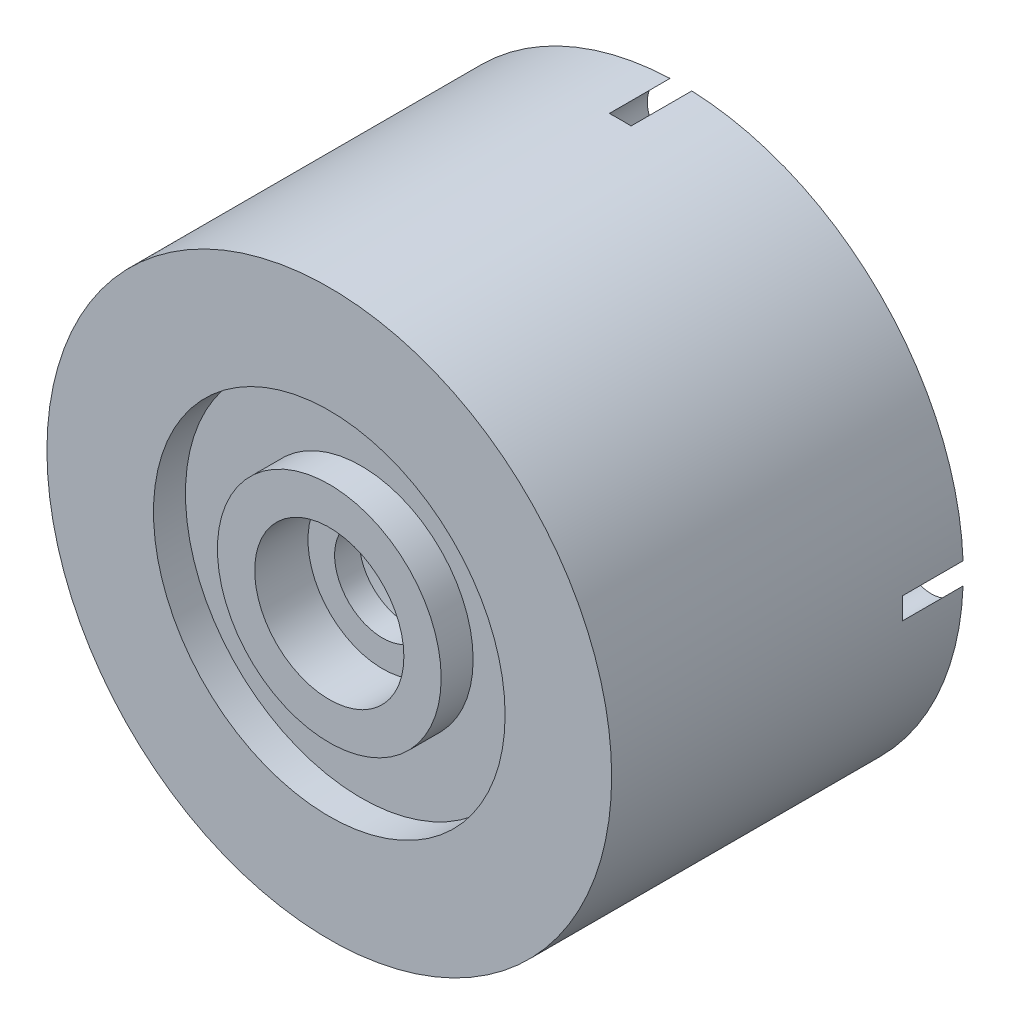
ISO-10303-21;
HEADER;
FILE_DESCRIPTION(('STEP AP214'),'2;1');
FILE_NAME('part.step','',(''),(''),'','','');
FILE_SCHEMA(('AUTOMOTIVE_DESIGN { 1 0 10303 214 1 1 1 1 }'));
ENDSEC;
DATA;
#1=APPLICATION_CONTEXT('core data for automotive mechanical design processes');
#2=APPLICATION_PROTOCOL_DEFINITION('international standard','automotive_design',2000,#1);
#3=PRODUCT_CONTEXT('',#1,'mechanical');
#4=PRODUCT('Part','Part','',(#3));
#5=PRODUCT_RELATED_PRODUCT_CATEGORY('part','',(#4));
#6=PRODUCT_DEFINITION_FORMATION('','',#4);
#7=PRODUCT_DEFINITION_CONTEXT('part definition',#1,'design');
#8=PRODUCT_DEFINITION('design','',#6,#7);
#9=PRODUCT_DEFINITION_SHAPE('','',#8);
#10=(LENGTH_UNIT() NAMED_UNIT(*) SI_UNIT(.MILLI.,.METRE.));
#11=(NAMED_UNIT(*) PLANE_ANGLE_UNIT() SI_UNIT($,.RADIAN.));
#12=(NAMED_UNIT(*) SI_UNIT($,.STERADIAN.) SOLID_ANGLE_UNIT());
#13=UNCERTAINTY_MEASURE_WITH_UNIT(LENGTH_MEASURE(1.E-05),#10,'distance_accuracy_value','');
#14=(GEOMETRIC_REPRESENTATION_CONTEXT(3) GLOBAL_UNCERTAINTY_ASSIGNED_CONTEXT((#13)) GLOBAL_UNIT_ASSIGNED_CONTEXT((#10,
#11,#12)) REPRESENTATION_CONTEXT('',''));
#15=CARTESIAN_POINT('',(0.,0.,0.));
#16=DIRECTION('',(0.,0.,1.));
#17=DIRECTION('',(1.,0.,0.));
#18=AXIS2_PLACEMENT_3D('',#15,#16,#17);
#19=CARTESIAN_POINT('',(0.,0.,10.));
#20=DIRECTION('',(0.,0.,1.));
#21=DIRECTION('',(1.,0.,0.));
#22=AXIS2_PLACEMENT_3D('',#19,#20,#21);
#23=CYLINDRICAL_SURFACE('',#22,21.5);
#24=CARTESIAN_POINT('',(0.,0.,-11.01));
#25=DIRECTION('',(0.,0.,1.));
#26=DIRECTION('',(1.,0.,0.));
#27=AXIS2_PLACEMENT_3D('',#24,#25,#26);
#28=CIRCLE('',#27,21.5);
#29=CARTESIAN_POINT('',(21.5,0.,-11.01));
#30=VERTEX_POINT('',#29);
#31=EDGE_CURVE('E323',#30,#30,#28,.T.);
#32=ORIENTED_EDGE('',*,*,#31,.T.);
#33=EDGE_LOOP('',(#32));
#34=FACE_BOUND('',#33,.T.);
#35=CARTESIAN_POINT('',(0.,0.,-36.7));
#36=DIRECTION('',(0.,0.,1.));
#37=DIRECTION('',(1.,0.,0.));
#38=AXIS2_PLACEMENT_3D('',#35,#36,#37);
#39=CIRCLE('',#38,21.5);
#40=CARTESIAN_POINT('',(2.32434480356185,-21.3739893617021,-36.7));
#41=VERTEX_POINT('',#40);
#42=CARTESIAN_POINT('',(13.4875511302153,-16.7432363809936,-36.7));
#43=VERTEX_POINT('',#42);
#44=EDGE_CURVE('E435',#41,#43,#39,.T.);
#45=ORIENTED_EDGE('',*,*,#44,.F.);
#46=DIRECTION('',(0.,0.,-1.));
#47=VECTOR('',#46,1.);
#48=CARTESIAN_POINT('',(2.32434480356185,-21.3739893617021,-33.85));
#49=LINE('',#48,#47);
#50=CARTESIAN_POINT('',(2.32434480356186,-21.3739893617021,-31.));
#51=VERTEX_POINT('',#50);
#52=EDGE_CURVE('E225',#41,#51,#49,.F.);
#53=ORIENTED_EDGE('',*,*,#52,.T.);
#54=CARTESIAN_POINT('',(0.,0.,-31.));
#55=DIRECTION('',(0.,0.,1.));
#56=DIRECTION('',(1.,0.,0.));
#57=AXIS2_PLACEMENT_3D('',#54,#55,#56);
#58=CIRCLE('',#57,21.5);
#59=CARTESIAN_POINT('',(-2.32434480356155,-21.3739893617021,-31.));
#60=VERTEX_POINT('',#59);
#61=EDGE_CURVE('E227',#60,#51,#58,.T.);
#62=ORIENTED_EDGE('',*,*,#61,.F.);
#63=DIRECTION('',(0.,0.,-1.));
#64=VECTOR('',#63,1.);
#65=CARTESIAN_POINT('',(-2.32434480356155,-21.3739893617021,-33.85));
#66=LINE('',#65,#64);
#67=CARTESIAN_POINT('',(-2.32434480356155,-21.3739893617021,-36.7));
#68=VERTEX_POINT('',#67);
#69=EDGE_CURVE('E230',#60,#68,#66,.T.);
#70=ORIENTED_EDGE('',*,*,#69,.T.);
#71=CARTESIAN_POINT('',(-13.4875511302152,-16.7432363809937,-36.7));
#72=VERTEX_POINT('',#71);
#73=EDGE_CURVE('E364',#72,#68,#39,.T.);
#74=ORIENTED_EDGE('',*,*,#73,.F.);
#75=DIRECTION('',(0.,0.,-1.));
#76=VECTOR('',#75,1.);
#77=CARTESIAN_POINT('',(-13.4875511302152,-16.7432363809937,-31.2));
#78=LINE('',#77,#76);
#79=CARTESIAN_POINT('',(-13.4875511302152,-16.7432363809937,-25.7));
#80=VERTEX_POINT('',#79);
#81=EDGE_CURVE('E308',#72,#80,#78,.F.);
#82=ORIENTED_EDGE('',*,*,#81,.T.);
#83=CARTESIAN_POINT('',(0.,0.,-25.7));
#84=DIRECTION('',(0.,0.,1.));
#85=DIRECTION('',(1.,0.,0.));
#86=AXIS2_PLACEMENT_3D('',#83,#84,#85);
#87=CIRCLE('',#86,21.5);
#88=CARTESIAN_POINT('',(-16.7432363809936,-13.4875511302153,-25.7));
#89=VERTEX_POINT('',#88);
#90=EDGE_CURVE('E366',#89,#80,#87,.T.);
#91=ORIENTED_EDGE('',*,*,#90,.F.);
#92=DIRECTION('',(0.,0.,-1.));
#93=VECTOR('',#92,1.);
#94=CARTESIAN_POINT('',(-16.7432363809936,-13.4875511302153,-31.2));
#95=LINE('',#94,#93);
#96=CARTESIAN_POINT('',(-16.7432363809936,-13.4875511302153,-36.7));
#97=VERTEX_POINT('',#96);
#98=EDGE_CURVE('E303',#89,#97,#95,.T.);
#99=ORIENTED_EDGE('',*,*,#98,.T.);
#100=CARTESIAN_POINT('',(-21.3739893617021,-2.32434480356178,-36.7));
#101=VERTEX_POINT('',#100);
#102=EDGE_CURVE('E363',#101,#97,#39,.T.);
#103=ORIENTED_EDGE('',*,*,#102,.F.);
#104=DIRECTION('',(0.,0.,-1.));
#105=VECTOR('',#104,1.);
#106=CARTESIAN_POINT('',(-21.3739893617021,-2.32434480356178,-33.85));
#107=LINE('',#106,#105);
#108=CARTESIAN_POINT('',(-21.3739893617021,-2.32434480356178,-31.));
#109=VERTEX_POINT('',#108);
#110=EDGE_CURVE('E248',#101,#109,#107,.F.);
#111=ORIENTED_EDGE('',*,*,#110,.T.);
#112=CARTESIAN_POINT('',(0.,0.,-31.));
#113=DIRECTION('',(0.,0.,1.));
#114=DIRECTION('',(1.,0.,0.));
#115=AXIS2_PLACEMENT_3D('',#112,#113,#114);
#116=CIRCLE('',#115,21.5);
#117=CARTESIAN_POINT('',(-21.3739893617021,2.32434480356162,-31.));
#118=VERTEX_POINT('',#117);
#119=EDGE_CURVE('E239',#118,#109,#116,.T.);
#120=ORIENTED_EDGE('',*,*,#119,.F.);
#121=DIRECTION('',(0.,0.,-1.));
#122=VECTOR('',#121,1.);
#123=CARTESIAN_POINT('',(-21.3739893617021,2.32434480356162,-33.85));
#124=LINE('',#123,#122);
#125=CARTESIAN_POINT('',(-21.3739893617021,2.32434480356162,-36.7));
#126=VERTEX_POINT('',#125);
#127=EDGE_CURVE('E245',#118,#126,#124,.T.);
#128=ORIENTED_EDGE('',*,*,#127,.T.);
#129=CARTESIAN_POINT('',(-16.7432363809936,13.4875511302153,-36.7));
#130=VERTEX_POINT('',#129);
#131=EDGE_CURVE('E359',#130,#126,#39,.T.);
#132=ORIENTED_EDGE('',*,*,#131,.F.);
#133=DIRECTION('',(0.,0.,-1.));
#134=VECTOR('',#133,1.);
#135=CARTESIAN_POINT('',(-16.7432363809936,13.4875511302153,-31.2));
#136=LINE('',#135,#134);
#137=CARTESIAN_POINT('',(-16.7432363809936,13.4875511302153,-25.7));
#138=VERTEX_POINT('',#137);
#139=EDGE_CURVE('E320',#130,#138,#136,.F.);
#140=ORIENTED_EDGE('',*,*,#139,.T.);
#141=CARTESIAN_POINT('',(0.,0.,-25.7));
#142=DIRECTION('',(0.,0.,1.));
#143=DIRECTION('',(1.,0.,0.));
#144=AXIS2_PLACEMENT_3D('',#141,#142,#143);
#145=CIRCLE('',#144,21.5);
#146=CARTESIAN_POINT('',(-13.4875511302153,16.7432363809936,-25.7));
#147=VERTEX_POINT('',#146);
#148=EDGE_CURVE('E362',#147,#138,#145,.T.);
#149=ORIENTED_EDGE('',*,*,#148,.F.);
#150=DIRECTION('',(0.,0.,-1.));
#151=VECTOR('',#150,1.);
#152=CARTESIAN_POINT('',(-13.4875511302153,16.7432363809936,-31.2));
#153=LINE('',#152,#151);
#154=CARTESIAN_POINT('',(-13.4875511302153,16.7432363809936,-36.7));
#155=VERTEX_POINT('',#154);
#156=EDGE_CURVE('E315',#147,#155,#153,.T.);
#157=ORIENTED_EDGE('',*,*,#156,.T.);
#158=CARTESIAN_POINT('',(-2.324344803562,21.3739893617021,-36.7));
#159=VERTEX_POINT('',#158);
#160=EDGE_CURVE('E357',#159,#155,#39,.T.);
#161=ORIENTED_EDGE('',*,*,#160,.F.);
#162=DIRECTION('',(0.,0.,-1.));
#163=VECTOR('',#162,1.);
#164=CARTESIAN_POINT('',(-2.324344803562,21.3739893617021,-33.85));
#165=LINE('',#164,#163);
#166=CARTESIAN_POINT('',(-2.324344803562,21.3739893617021,-31.));
#167=VERTEX_POINT('',#166);
#168=EDGE_CURVE('E53',#159,#167,#165,.F.);
#169=ORIENTED_EDGE('',*,*,#168,.T.);
#170=CARTESIAN_POINT('',(0.,0.,-31.));
#171=DIRECTION('',(0.,0.,1.));
#172=DIRECTION('',(1.,0.,0.));
#173=AXIS2_PLACEMENT_3D('',#170,#171,#172);
#174=CIRCLE('',#173,21.5);
#175=CARTESIAN_POINT('',(2.3243448035614,21.3739893617022,-31.));
#176=VERTEX_POINT('',#175);
#177=EDGE_CURVE('E216',#176,#167,#174,.T.);
#178=ORIENTED_EDGE('',*,*,#177,.F.);
#179=DIRECTION('',(0.,0.,-1.));
#180=VECTOR('',#179,1.);
#181=CARTESIAN_POINT('',(2.3243448035614,21.3739893617022,-33.85));
#182=LINE('',#181,#180);
#183=CARTESIAN_POINT('',(2.3243448035614,21.3739893617022,-36.7));
#184=VERTEX_POINT('',#183);
#185=EDGE_CURVE('E200',#176,#184,#182,.T.);
#186=ORIENTED_EDGE('',*,*,#185,.T.);
#187=CARTESIAN_POINT('',(13.4875511302151,16.7432363809938,-36.7));
#188=VERTEX_POINT('',#187);
#189=EDGE_CURVE('E437',#188,#184,#39,.T.);
#190=ORIENTED_EDGE('',*,*,#189,.F.);
#191=DIRECTION('',(0.,0.,-1.));
#192=VECTOR('',#191,1.);
#193=CARTESIAN_POINT('',(13.4875511302151,16.7432363809938,-31.2));
#194=LINE('',#193,#192);
#195=CARTESIAN_POINT('',(13.4875511302151,16.7432363809938,-25.7));
#196=VERTEX_POINT('',#195);
#197=EDGE_CURVE('E284',#188,#196,#194,.F.);
#198=ORIENTED_EDGE('',*,*,#197,.T.);
#199=CARTESIAN_POINT('',(0.,0.,-25.7));
#200=DIRECTION('',(0.,0.,1.));
#201=DIRECTION('',(1.,0.,0.));
#202=AXIS2_PLACEMENT_3D('',#199,#200,#201);
#203=CIRCLE('',#202,21.5);
#204=CARTESIAN_POINT('',(16.7432363809935,13.4875511302155,-25.7));
#205=VERTEX_POINT('',#204);
#206=EDGE_CURVE('E370',#205,#196,#203,.T.);
#207=ORIENTED_EDGE('',*,*,#206,.F.);
#208=DIRECTION('',(0.,0.,-1.));
#209=VECTOR('',#208,1.);
#210=CARTESIAN_POINT('',(16.7432363809935,13.4875511302155,-31.2));
#211=LINE('',#210,#209);
#212=CARTESIAN_POINT('',(16.7432363809935,13.4875511302155,-36.7));
#213=VERTEX_POINT('',#212);
#214=EDGE_CURVE('E279',#205,#213,#211,.T.);
#215=ORIENTED_EDGE('',*,*,#214,.T.);
#216=CARTESIAN_POINT('',(21.3739893617021,2.32434480356178,-36.7));
#217=VERTEX_POINT('',#216);
#218=EDGE_CURVE('E438',#217,#213,#39,.T.);
#219=ORIENTED_EDGE('',*,*,#218,.F.);
#220=DIRECTION('',(0.,0.,-1.));
#221=VECTOR('',#220,1.);
#222=CARTESIAN_POINT('',(21.3739893617021,2.32434480356178,-33.85));
#223=LINE('',#222,#221);
#224=CARTESIAN_POINT('',(21.3739893617021,2.32434480356178,-31.));
#225=VERTEX_POINT('',#224);
#226=EDGE_CURVE('E61',#217,#225,#223,.F.);
#227=ORIENTED_EDGE('',*,*,#226,.T.);
#228=CARTESIAN_POINT('',(0.,0.,-31.));
#229=DIRECTION('',(0.,0.,1.));
#230=DIRECTION('',(1.,0.,0.));
#231=AXIS2_PLACEMENT_3D('',#228,#229,#230);
#232=CIRCLE('',#231,21.5);
#233=CARTESIAN_POINT('',(21.3739893617021,-2.32434480356162,-31.));
#234=VERTEX_POINT('',#233);
#235=EDGE_CURVE('E224',#234,#225,#232,.T.);
#236=ORIENTED_EDGE('',*,*,#235,.F.);
#237=DIRECTION('',(0.,0.,-1.));
#238=VECTOR('',#237,1.);
#239=CARTESIAN_POINT('',(21.3739893617021,-2.32434480356162,-33.85));
#240=LINE('',#239,#238);
#241=CARTESIAN_POINT('',(21.3739893617021,-2.32434480356162,-36.7));
#242=VERTEX_POINT('',#241);
#243=EDGE_CURVE('E404',#234,#242,#240,.T.);
#244=ORIENTED_EDGE('',*,*,#243,.T.);
#245=CARTESIAN_POINT('',(16.7432363809936,-13.4875511302153,-36.7));
#246=VERTEX_POINT('',#245);
#247=EDGE_CURVE('E436',#246,#242,#39,.T.);
#248=ORIENTED_EDGE('',*,*,#247,.F.);
#249=DIRECTION('',(0.,0.,-1.));
#250=VECTOR('',#249,1.);
#251=CARTESIAN_POINT('',(16.7432363809936,-13.4875511302153,-31.2));
#252=LINE('',#251,#250);
#253=CARTESIAN_POINT('',(16.7432363809936,-13.4875511302153,-25.7));
#254=VERTEX_POINT('',#253);
#255=EDGE_CURVE('E296',#246,#254,#252,.F.);
#256=ORIENTED_EDGE('',*,*,#255,.T.);
#257=CARTESIAN_POINT('',(0.,0.,-25.7));
#258=DIRECTION('',(0.,0.,1.));
#259=DIRECTION('',(1.,0.,0.));
#260=AXIS2_PLACEMENT_3D('',#257,#258,#259);
#261=CIRCLE('',#260,21.5);
#262=CARTESIAN_POINT('',(13.4875511302153,-16.7432363809936,-25.7));
#263=VERTEX_POINT('',#262);
#264=EDGE_CURVE('E368',#263,#254,#261,.T.);
#265=ORIENTED_EDGE('',*,*,#264,.F.);
#266=DIRECTION('',(0.,0.,-1.));
#267=VECTOR('',#266,1.);
#268=CARTESIAN_POINT('',(13.4875511302153,-16.7432363809936,-31.2));
#269=LINE('',#268,#267);
#270=EDGE_CURVE('E291',#263,#43,#269,.T.);
#271=ORIENTED_EDGE('',*,*,#270,.T.);
#272=EDGE_LOOP('',(#45,#53,#62,#70,#74,#82,#91,#99,#103,#111,#120,#128,#132,#140,#149,#157,#161,
#169,#178,#186,#190,#198,#207,#215,#219,#227,#236,#244,#248,#256,#265,#271));
#273=FACE_BOUND('',#272,.T.);
#274=ADVANCED_FACE('F39',(#34,#273),#23,.F.);
#275=CARTESIAN_POINT('',(0.,0.,10.));
#276=DIRECTION('',(0.,0.,1.));
#277=DIRECTION('',(1.,0.,0.));
#278=AXIS2_PLACEMENT_3D('',#275,#276,#277);
#279=CYLINDRICAL_SURFACE('',#278,26.5);
#280=CARTESIAN_POINT('',(0.,0.,-3.7));
#281=DIRECTION('',(0.,0.,1.));
#282=DIRECTION('',(1.,0.,0.));
#283=AXIS2_PLACEMENT_3D('',#280,#281,#282);
#284=CIRCLE('',#283,26.5);
#285=CARTESIAN_POINT('',(26.5,0.,-3.7));
#286=VERTEX_POINT('',#285);
#287=EDGE_CURVE('E350',#286,#286,#284,.T.);
#288=ORIENTED_EDGE('',*,*,#287,.F.);
#289=EDGE_LOOP('',(#288));
#290=FACE_BOUND('',#289,.T.);
#291=CARTESIAN_POINT('',(0.,0.,-31.));
#292=DIRECTION('',(0.,0.,1.));
#293=DIRECTION('',(1.,0.,0.));
#294=AXIS2_PLACEMENT_3D('',#291,#292,#293);
#295=CIRCLE('',#294,26.5);
#296=CARTESIAN_POINT('',(1.01974541549685,-26.4803723404255,-31.));
#297=VERTEX_POINT('',#296);
#298=CARTESIAN_POINT('',(-1.01974541549647,-26.4803723404255,-31.));
#299=VERTEX_POINT('',#298);
#300=EDGE_CURVE('E11',#297,#299,#295,.F.);
#301=ORIENTED_EDGE('',*,*,#300,.F.);
#302=DIRECTION('',(0.,0.,-1.));
#303=VECTOR('',#302,1.);
#304=CARTESIAN_POINT('',(1.01974541549686,-26.4803723404255,-33.85));
#305=LINE('',#304,#303);
#306=CARTESIAN_POINT('',(1.01974541549686,-26.4803723404255,-36.7));
#307=VERTEX_POINT('',#306);
#308=EDGE_CURVE('E422',#297,#307,#305,.T.);
#309=ORIENTED_EDGE('',*,*,#308,.T.);
#310=CARTESIAN_POINT('',(0.,0.,-36.7));
#311=DIRECTION('',(0.,0.,1.));
#312=DIRECTION('',(1.,0.,0.));
#313=AXIS2_PLACEMENT_3D('',#310,#311,#312);
#314=CIRCLE('',#313,26.5);
#315=CARTESIAN_POINT('',(26.4803723404255,-1.01974541549657,-36.7));
#316=VERTEX_POINT('',#315);
#317=EDGE_CURVE('E358',#307,#316,#314,.T.);
#318=ORIENTED_EDGE('',*,*,#317,.T.);
#319=DIRECTION('',(0.,0.,-1.));
#320=VECTOR('',#319,1.);
#321=CARTESIAN_POINT('',(26.4803723404255,-1.01974541549657,-33.85));
#322=LINE('',#321,#320);
#323=CARTESIAN_POINT('',(26.4803723404255,-1.01974541549656,-31.));
#324=VERTEX_POINT('',#323);
#325=EDGE_CURVE('E401',#316,#324,#322,.F.);
#326=ORIENTED_EDGE('',*,*,#325,.T.);
#327=CARTESIAN_POINT('',(0.,0.,-31.));
#328=DIRECTION('',(0.,0.,1.));
#329=DIRECTION('',(1.,0.,0.));
#330=AXIS2_PLACEMENT_3D('',#327,#328,#329);
#331=CIRCLE('',#330,26.5);
#332=CARTESIAN_POINT('',(26.4803723404255,1.01974541549676,-31.));
#333=VERTEX_POINT('',#332);
#334=EDGE_CURVE('E46',#333,#324,#331,.F.);
#335=ORIENTED_EDGE('',*,*,#334,.F.);
#336=DIRECTION('',(0.,0.,-1.));
#337=VECTOR('',#336,1.);
#338=CARTESIAN_POINT('',(26.4803723404255,1.01974541549677,-33.85));
#339=LINE('',#338,#337);
#340=CARTESIAN_POINT('',(26.4803723404255,1.01974541549677,-36.7));
#341=VERTEX_POINT('',#340);
#342=EDGE_CURVE('E412',#333,#341,#339,.T.);
#343=ORIENTED_EDGE('',*,*,#342,.T.);
#344=CARTESIAN_POINT('',(1.01974541549629,26.4803723404255,-36.7));
#345=VERTEX_POINT('',#344);
#346=EDGE_CURVE('E550',#341,#345,#314,.T.);
#347=ORIENTED_EDGE('',*,*,#346,.T.);
#348=DIRECTION('',(0.,0.,-1.));
#349=VECTOR('',#348,1.);
#350=CARTESIAN_POINT('',(1.01974541549629,26.4803723404255,-33.85));
#351=LINE('',#350,#349);
#352=CARTESIAN_POINT('',(1.01974541549628,26.4803723404255,-31.));
#353=VERTEX_POINT('',#352);
#354=EDGE_CURVE('E553',#345,#353,#351,.F.);
#355=ORIENTED_EDGE('',*,*,#354,.T.);
#356=CARTESIAN_POINT('',(0.,0.,-31.));
#357=DIRECTION('',(0.,0.,1.));
#358=DIRECTION('',(1.,0.,0.));
#359=AXIS2_PLACEMENT_3D('',#356,#357,#358);
#360=CIRCLE('',#359,26.5);
#361=CARTESIAN_POINT('',(-1.01974541549703,26.4803723404255,-31.));
#362=VERTEX_POINT('',#361);
#363=EDGE_CURVE('E218',#362,#353,#360,.F.);
#364=ORIENTED_EDGE('',*,*,#363,.F.);
#365=DIRECTION('',(0.,0.,-1.));
#366=VECTOR('',#365,1.);
#367=CARTESIAN_POINT('',(-1.01974541549704,26.4803723404255,-33.85));
#368=LINE('',#367,#366);
#369=CARTESIAN_POINT('',(-1.01974541549704,26.4803723404255,-36.7));
#370=VERTEX_POINT('',#369);
#371=EDGE_CURVE('E211',#362,#370,#368,.T.);
#372=ORIENTED_EDGE('',*,*,#371,.T.);
#373=CARTESIAN_POINT('',(-26.4803723404255,1.01974541549656,-36.7));
#374=VERTEX_POINT('',#373);
#375=EDGE_CURVE('E353',#370,#374,#314,.T.);
#376=ORIENTED_EDGE('',*,*,#375,.T.);
#377=DIRECTION('',(0.,0.,-1.));
#378=VECTOR('',#377,1.);
#379=CARTESIAN_POINT('',(-26.4803723404255,1.01974541549657,-33.85));
#380=LINE('',#379,#378);
#381=CARTESIAN_POINT('',(-26.4803723404255,1.01974541549656,-31.));
#382=VERTEX_POINT('',#381);
#383=EDGE_CURVE('E374',#374,#382,#380,.F.);
#384=ORIENTED_EDGE('',*,*,#383,.T.);
#385=CARTESIAN_POINT('',(0.,0.,-31.));
#386=DIRECTION('',(0.,0.,1.));
#387=DIRECTION('',(1.,0.,0.));
#388=AXIS2_PLACEMENT_3D('',#385,#386,#387);
#389=CIRCLE('',#388,26.5);
#390=CARTESIAN_POINT('',(-26.4803723404255,-1.01974541549676,-31.));
#391=VERTEX_POINT('',#390);
#392=EDGE_CURVE('E372',#391,#382,#389,.F.);
#393=ORIENTED_EDGE('',*,*,#392,.F.);
#394=DIRECTION('',(0.,0.,-1.));
#395=VECTOR('',#394,1.);
#396=CARTESIAN_POINT('',(-26.4803723404255,-1.01974541549677,-33.85));
#397=LINE('',#396,#395);
#398=CARTESIAN_POINT('',(-26.4803723404255,-1.01974541549676,-36.7));
#399=VERTEX_POINT('',#398);
#400=EDGE_CURVE('E377',#391,#399,#397,.T.);
#401=ORIENTED_EDGE('',*,*,#400,.T.);
#402=CARTESIAN_POINT('',(-1.01974541549648,-26.4803723404255,-36.7));
#403=VERTEX_POINT('',#402);
#404=EDGE_CURVE('E354',#399,#403,#314,.T.);
#405=ORIENTED_EDGE('',*,*,#404,.T.);
#406=DIRECTION('',(0.,0.,-1.));
#407=VECTOR('',#406,1.);
#408=CARTESIAN_POINT('',(-1.01974541549648,-26.4803723404255,-33.85));
#409=LINE('',#408,#407);
#410=EDGE_CURVE('E419',#403,#299,#409,.F.);
#411=ORIENTED_EDGE('',*,*,#410,.T.);
#412=EDGE_LOOP('',(#301,#309,#318,#326,#335,#343,#347,#355,#364,#372,#376,#384,#393,#401,#405,#411));
#413=FACE_BOUND('',#412,.T.);
#414=ADVANCED_FACE('F409',(#290,#413),#279,.T.);
#415=CARTESIAN_POINT('',(21.5,0.,-36.7));
#416=DIRECTION('',(0.,0.,-1.));
#417=DIRECTION('',(-1.,0.,0.));
#418=AXIS2_PLACEMENT_3D('',#415,#416,#417);
#419=PLANE('',#418);
#420=CARTESIAN_POINT('',(16.4755880016466,-16.4755880016466,-36.7));
#421=DIRECTION('',(0.,0.,1.));
#422=DIRECTION('',(-1.,0.,0.));
#423=AXIS2_PLACEMENT_3D('',#420,#421,#422);
#424=CIRCLE('',#423,1.4);
#425=CARTESIAN_POINT('',(15.0755880016466,-16.4755880016466,-36.7));
#426=VERTEX_POINT('',#425);
#427=EDGE_CURVE('E262',#426,#426,#424,.T.);
#428=ORIENTED_EDGE('',*,*,#427,.T.);
#429=EDGE_LOOP('',(#428));
#430=FACE_BOUND('',#429,.T.);
#431=ORIENTED_EDGE('',*,*,#317,.F.);
#432=CARTESIAN_POINT('',(1.6985546288162E-13,-23.5,-36.7));
#433=DIRECTION('',(0.,0.,-1.));
#434=DIRECTION('',(-1.,0.,0.));
#435=AXIS2_PLACEMENT_3D('',#432,#433,#434);
#436=CIRCLE('',#435,3.15);
#437=EDGE_CURVE('E384',#307,#41,#436,.F.);
#438=ORIENTED_EDGE('',*,*,#437,.T.);
#439=ORIENTED_EDGE('',*,*,#44,.T.);
#440=CARTESIAN_POINT('',(16.4755880016466,-16.4755880016466,-36.7));
#441=DIRECTION('',(0.,0.,1.));
#442=DIRECTION('',(-1.,0.,0.));
#443=AXIS2_PLACEMENT_3D('',#440,#441,#442);
#444=CIRCLE('',#443,3.);
#445=EDGE_CURVE('E287',#246,#43,#444,.T.);
#446=ORIENTED_EDGE('',*,*,#445,.F.);
#447=ORIENTED_EDGE('',*,*,#247,.T.);
#448=CARTESIAN_POINT('',(23.5,0.,-36.7));
#449=DIRECTION('',(0.,0.,1.));
#450=DIRECTION('',(-1.,0.,0.));
#451=AXIS2_PLACEMENT_3D('',#448,#449,#450);
#452=CIRCLE('',#451,3.15);
#453=EDGE_CURVE('E219',#242,#316,#452,.T.);
#454=ORIENTED_EDGE('',*,*,#453,.T.);
#455=EDGE_LOOP('',(#431,#438,#439,#446,#447,#454));
#456=FACE_BOUND('',#455,.T.);
#457=ADVANCED_FACE('F472',(#430,#456),#419,.T.);
#458=CARTESIAN_POINT('',(-16.4755880016465,-16.4755880016466,-36.7));
#459=DIRECTION('',(0.,0.,1.));
#460=DIRECTION('',(0.,1.,0.));
#461=AXIS2_PLACEMENT_3D('',#458,#459,#460);
#462=CIRCLE('',#461,1.4);
#463=CARTESIAN_POINT('',(-16.4755880016465,-15.0755880016466,-36.7));
#464=VERTEX_POINT('',#463);
#465=EDGE_CURVE('E256',#464,#464,#462,.T.);
#466=ORIENTED_EDGE('',*,*,#465,.T.);
#467=EDGE_LOOP('',(#466));
#468=FACE_BOUND('',#467,.T.);
#469=ORIENTED_EDGE('',*,*,#73,.T.);
#470=CARTESIAN_POINT('',(1.6985546288162E-13,-23.5,-36.7));
#471=DIRECTION('',(0.,0.,1.));
#472=DIRECTION('',(0.,1.,0.));
#473=AXIS2_PLACEMENT_3D('',#470,#471,#472);
#474=CIRCLE('',#473,3.15);
#475=EDGE_CURVE('E405',#68,#403,#474,.T.);
#476=ORIENTED_EDGE('',*,*,#475,.T.);
#477=ORIENTED_EDGE('',*,*,#404,.F.);
#478=CARTESIAN_POINT('',(-23.5,0.,-36.7));
#479=DIRECTION('',(0.,0.,1.));
#480=DIRECTION('',(1.,0.,0.));
#481=AXIS2_PLACEMENT_3D('',#478,#479,#480);
#482=CIRCLE('',#481,3.15);
#483=EDGE_CURVE('E235',#399,#101,#482,.T.);
#484=ORIENTED_EDGE('',*,*,#483,.T.);
#485=ORIENTED_EDGE('',*,*,#102,.T.);
#486=CARTESIAN_POINT('',(-16.4755880016465,-16.4755880016466,-36.7));
#487=DIRECTION('',(0.,0.,1.));
#488=DIRECTION('',(0.,1.,0.));
#489=AXIS2_PLACEMENT_3D('',#486,#487,#488);
#490=CIRCLE('',#489,3.);
#491=EDGE_CURVE('E299',#72,#97,#490,.T.);
#492=ORIENTED_EDGE('',*,*,#491,.F.);
#493=EDGE_LOOP('',(#469,#476,#477,#484,#485,#492));
#494=FACE_BOUND('',#493,.T.);
#495=ADVANCED_FACE('F432',(#468,#494),#419,.T.);
#496=CARTESIAN_POINT('',(16.4755880016464,16.4755880016467,-36.7));
#497=DIRECTION('',(0.,0.,1.));
#498=DIRECTION('',(0.,-1.,0.));
#499=AXIS2_PLACEMENT_3D('',#496,#497,#498);
#500=CIRCLE('',#499,1.4);
#501=CARTESIAN_POINT('',(16.4755880016464,15.0755880016467,-36.7));
#502=VERTEX_POINT('',#501);
#503=EDGE_CURVE('E251',#502,#502,#500,.T.);
#504=ORIENTED_EDGE('',*,*,#503,.T.);
#505=EDGE_LOOP('',(#504));
#506=FACE_BOUND('',#505,.T.);
#507=ORIENTED_EDGE('',*,*,#346,.F.);
#508=CARTESIAN_POINT('',(23.5,0.,-36.7));
#509=DIRECTION('',(0.,0.,-1.));
#510=DIRECTION('',(-1.,0.,0.));
#511=AXIS2_PLACEMENT_3D('',#508,#509,#510);
#512=CIRCLE('',#511,3.15);
#513=EDGE_CURVE('E382',#341,#217,#512,.F.);
#514=ORIENTED_EDGE('',*,*,#513,.T.);
#515=ORIENTED_EDGE('',*,*,#218,.T.);
#516=CARTESIAN_POINT('',(16.4755880016464,16.4755880016467,-36.7));
#517=DIRECTION('',(0.,0.,1.));
#518=DIRECTION('',(0.,-1.,0.));
#519=AXIS2_PLACEMENT_3D('',#516,#517,#518);
#520=CIRCLE('',#519,3.);
#521=EDGE_CURVE('E273',#188,#213,#520,.T.);
#522=ORIENTED_EDGE('',*,*,#521,.F.);
#523=ORIENTED_EDGE('',*,*,#189,.T.);
#524=CARTESIAN_POINT('',(-3.33955085807247E-13,23.5,-36.7));
#525=DIRECTION('',(0.,0.,1.));
#526=DIRECTION('',(0.,-1.,0.));
#527=AXIS2_PLACEMENT_3D('',#524,#525,#526);
#528=CIRCLE('',#527,3.15);
#529=EDGE_CURVE('E206',#184,#345,#528,.T.);
#530=ORIENTED_EDGE('',*,*,#529,.T.);
#531=EDGE_LOOP('',(#507,#514,#515,#522,#523,#530));
#532=FACE_BOUND('',#531,.T.);
#533=ADVANCED_FACE('F486',(#506,#532),#419,.T.);
#534=CARTESIAN_POINT('',(-16.4755880016466,16.4755880016466,-36.7));
#535=DIRECTION('',(0.,0.,1.));
#536=DIRECTION('',(1.,0.,0.));
#537=AXIS2_PLACEMENT_3D('',#534,#535,#536);
#538=CIRCLE('',#537,1.4);
#539=CARTESIAN_POINT('',(-15.0755880016466,16.4755880016466,-36.7));
#540=VERTEX_POINT('',#539);
#541=EDGE_CURVE('E255',#540,#540,#538,.T.);
#542=ORIENTED_EDGE('',*,*,#541,.T.);
#543=EDGE_LOOP('',(#542));
#544=FACE_BOUND('',#543,.T.);
#545=ORIENTED_EDGE('',*,*,#375,.F.);
#546=CARTESIAN_POINT('',(-3.33955085807247E-13,23.5,-36.7));
#547=DIRECTION('',(0.,0.,-1.));
#548=DIRECTION('',(-1.,0.,0.));
#549=AXIS2_PLACEMENT_3D('',#546,#547,#548);
#550=CIRCLE('',#549,3.15);
#551=EDGE_CURVE('E380',#370,#159,#550,.F.);
#552=ORIENTED_EDGE('',*,*,#551,.T.);
#553=ORIENTED_EDGE('',*,*,#160,.T.);
#554=CARTESIAN_POINT('',(-16.4755880016466,16.4755880016466,-36.7));
#555=DIRECTION('',(0.,0.,1.));
#556=DIRECTION('',(1.,0.,0.));
#557=AXIS2_PLACEMENT_3D('',#554,#555,#556);
#558=CIRCLE('',#557,3.);
#559=EDGE_CURVE('E311',#130,#155,#558,.T.);
#560=ORIENTED_EDGE('',*,*,#559,.F.);
#561=ORIENTED_EDGE('',*,*,#131,.T.);
#562=EDGE_CURVE('E241',#126,#374,#482,.T.);
#563=ORIENTED_EDGE('',*,*,#562,.T.);
#564=EDGE_LOOP('',(#545,#552,#553,#560,#561,#563));
#565=FACE_BOUND('',#564,.T.);
#566=ADVANCED_FACE('F445',(#544,#565),#419,.T.);
#567=CARTESIAN_POINT('',(26.5,0.,-3.7));
#568=DIRECTION('',(0.,0.,1.));
#569=DIRECTION('',(1.,0.,0.));
#570=AXIS2_PLACEMENT_3D('',#567,#568,#569);
#571=PLANE('',#570);
#572=ORIENTED_EDGE('',*,*,#287,.T.);
#573=EDGE_LOOP('',(#572));
#574=FACE_BOUND('',#573,.T.);
#575=CARTESIAN_POINT('',(0.,0.,-3.7));
#576=DIRECTION('',(0.,0.,1.));
#577=DIRECTION('',(1.,0.,0.));
#578=AXIS2_PLACEMENT_3D('',#575,#576,#577);
#579=CIRCLE('',#578,16.5);
#580=CARTESIAN_POINT('',(16.5,0.,-3.7));
#581=VERTEX_POINT('',#580);
#582=EDGE_CURVE('E347',#581,#581,#579,.T.);
#583=ORIENTED_EDGE('',*,*,#582,.F.);
#584=EDGE_LOOP('',(#583));
#585=FACE_BOUND('',#584,.T.);
#586=ADVANCED_FACE('F483',(#574,#585),#571,.T.);
#587=CARTESIAN_POINT('',(0.,0.,10.));
#588=DIRECTION('',(0.,0.,1.));
#589=DIRECTION('',(1.,0.,0.));
#590=AXIS2_PLACEMENT_3D('',#587,#588,#589);
#591=CYLINDRICAL_SURFACE('',#590,16.5);
#592=ORIENTED_EDGE('',*,*,#582,.T.);
#593=EDGE_LOOP('',(#592));
#594=FACE_BOUND('',#593,.T.);
#595=CARTESIAN_POINT('',(0.,0.,-6.7));
#596=DIRECTION('',(0.,0.,1.));
#597=DIRECTION('',(1.,0.,0.));
#598=AXIS2_PLACEMENT_3D('',#595,#596,#597);
#599=CIRCLE('',#598,16.5);
#600=CARTESIAN_POINT('',(16.5,0.,-6.7));
#601=VERTEX_POINT('',#600);
#602=EDGE_CURVE('E344',#601,#601,#599,.T.);
#603=ORIENTED_EDGE('',*,*,#602,.F.);
#604=EDGE_LOOP('',(#603));
#605=FACE_BOUND('',#604,.T.);
#606=ADVANCED_FACE('F492',(#594,#605),#591,.F.);
#607=CARTESIAN_POINT('',(16.5,0.,-6.7));
#608=DIRECTION('',(0.,0.,1.));
#609=DIRECTION('',(1.,0.,0.));
#610=AXIS2_PLACEMENT_3D('',#607,#608,#609);
#611=PLANE('',#610);
#612=ORIENTED_EDGE('',*,*,#602,.T.);
#613=EDGE_LOOP('',(#612));
#614=FACE_BOUND('',#613,.T.);
#615=CARTESIAN_POINT('',(0.,0.,-6.7));
#616=DIRECTION('',(0.,0.,1.));
#617=DIRECTION('',(1.,0.,0.));
#618=AXIS2_PLACEMENT_3D('',#615,#616,#617);
#619=CIRCLE('',#618,10.5);
#620=CARTESIAN_POINT('',(10.5,0.,-6.7));
#621=VERTEX_POINT('',#620);
#622=EDGE_CURVE('E341',#621,#621,#619,.T.);
#623=ORIENTED_EDGE('',*,*,#622,.F.);
#624=EDGE_LOOP('',(#623));
#625=FACE_BOUND('',#624,.T.);
#626=ADVANCED_FACE('F940',(#614,#625),#611,.T.);
#627=CARTESIAN_POINT('',(0.,0.,10.));
#628=DIRECTION('',(0.,0.,1.));
#629=DIRECTION('',(1.,0.,0.));
#630=AXIS2_PLACEMENT_3D('',#627,#628,#629);
#631=CYLINDRICAL_SURFACE('',#630,10.5);
#632=ORIENTED_EDGE('',*,*,#622,.T.);
#633=EDGE_LOOP('',(#632));
#634=FACE_BOUND('',#633,.T.);
#635=CARTESIAN_POINT('',(0.,0.,-3.7));
#636=DIRECTION('',(0.,0.,1.));
#637=DIRECTION('',(1.,0.,0.));
#638=AXIS2_PLACEMENT_3D('',#635,#636,#637);
#639=CIRCLE('',#638,10.5);
#640=CARTESIAN_POINT('',(10.5,0.,-3.7));
#641=VERTEX_POINT('',#640);
#642=EDGE_CURVE('E338',#641,#641,#639,.T.);
#643=ORIENTED_EDGE('',*,*,#642,.F.);
#644=EDGE_LOOP('',(#643));
#645=FACE_BOUND('',#644,.T.);
#646=ADVANCED_FACE('F929',(#634,#645),#631,.T.);
#647=CARTESIAN_POINT('',(10.5,0.,-3.7));
#648=DIRECTION('',(0.,0.,1.));
#649=DIRECTION('',(1.,0.,0.));
#650=AXIS2_PLACEMENT_3D('',#647,#648,#649);
#651=PLANE('',#650);
#652=ORIENTED_EDGE('',*,*,#642,.T.);
#653=EDGE_LOOP('',(#652));
#654=FACE_BOUND('',#653,.T.);
#655=CARTESIAN_POINT('',(0.,0.,-3.7));
#656=DIRECTION('',(0.,0.,1.));
#657=DIRECTION('',(1.,0.,0.));
#658=AXIS2_PLACEMENT_3D('',#655,#656,#657);
#659=CIRCLE('',#658,7.);
#660=CARTESIAN_POINT('',(7.,0.,-3.7));
#661=VERTEX_POINT('',#660);
#662=EDGE_CURVE('E335',#661,#661,#659,.T.);
#663=ORIENTED_EDGE('',*,*,#662,.F.);
#664=EDGE_LOOP('',(#663));
#665=FACE_BOUND('',#664,.T.);
#666=ADVANCED_FACE('F918',(#654,#665),#651,.T.);
#667=CARTESIAN_POINT('',(0.,0.,10.));
#668=DIRECTION('',(0.,0.,1.));
#669=DIRECTION('',(1.,0.,0.));
#670=AXIS2_PLACEMENT_3D('',#667,#668,#669);
#671=CYLINDRICAL_SURFACE('',#670,7.);
#672=ORIENTED_EDGE('',*,*,#662,.T.);
#673=EDGE_LOOP('',(#672));
#674=FACE_BOUND('',#673,.T.);
#675=CARTESIAN_POINT('',(0.,0.,-8.7));
#676=DIRECTION('',(0.,0.,1.));
#677=DIRECTION('',(1.,0.,0.));
#678=AXIS2_PLACEMENT_3D('',#675,#676,#677);
#679=CIRCLE('',#678,7.);
#680=CARTESIAN_POINT('',(7.,0.,-8.7));
#681=VERTEX_POINT('',#680);
#682=EDGE_CURVE('E332',#681,#681,#679,.T.);
#683=ORIENTED_EDGE('',*,*,#682,.F.);
#684=EDGE_LOOP('',(#683));
#685=FACE_BOUND('',#684,.T.);
#686=ADVANCED_FACE('F907',(#674,#685),#671,.F.);
#687=CARTESIAN_POINT('',(7.,0.,-8.7));
#688=DIRECTION('',(0.,0.,1.));
#689=DIRECTION('',(1.,0.,0.));
#690=AXIS2_PLACEMENT_3D('',#687,#688,#689);
#691=PLANE('',#690);
#692=ORIENTED_EDGE('',*,*,#682,.T.);
#693=EDGE_LOOP('',(#692));
#694=FACE_BOUND('',#693,.T.);
#695=CARTESIAN_POINT('',(0.,0.,-8.7));
#696=DIRECTION('',(0.,0.,1.));
#697=DIRECTION('',(1.,0.,0.));
#698=AXIS2_PLACEMENT_3D('',#695,#696,#697);
#699=CIRCLE('',#698,4.5);
#700=CARTESIAN_POINT('',(4.5,0.,-8.7));
#701=VERTEX_POINT('',#700);
#702=EDGE_CURVE('E329',#701,#701,#699,.T.);
#703=ORIENTED_EDGE('',*,*,#702,.F.);
#704=EDGE_LOOP('',(#703));
#705=FACE_BOUND('',#704,.T.);
#706=ADVANCED_FACE('F896',(#694,#705),#691,.T.);
#707=CARTESIAN_POINT('',(0.,0.,10.));
#708=DIRECTION('',(0.,0.,1.));
#709=DIRECTION('',(1.,0.,0.));
#710=AXIS2_PLACEMENT_3D('',#707,#708,#709);
#711=CYLINDRICAL_SURFACE('',#710,4.5);
#712=ORIENTED_EDGE('',*,*,#702,.T.);
#713=EDGE_LOOP('',(#712));
#714=FACE_BOUND('',#713,.T.);
#715=CARTESIAN_POINT('',(0.,0.,-11.01));
#716=DIRECTION('',(0.,0.,1.));
#717=DIRECTION('',(1.,0.,0.));
#718=AXIS2_PLACEMENT_3D('',#715,#716,#717);
#719=CIRCLE('',#718,4.5);
#720=CARTESIAN_POINT('',(4.5,0.,-11.01));
#721=VERTEX_POINT('',#720);
#722=EDGE_CURVE('E326',#721,#721,#719,.T.);
#723=ORIENTED_EDGE('',*,*,#722,.F.);
#724=EDGE_LOOP('',(#723));
#725=FACE_BOUND('',#724,.T.);
#726=ADVANCED_FACE('F463',(#714,#725),#711,.F.);
#727=CARTESIAN_POINT('',(4.5,0.,-11.01));
#728=DIRECTION('',(0.,0.,-1.));
#729=DIRECTION('',(-1.,0.,0.));
#730=AXIS2_PLACEMENT_3D('',#727,#728,#729);
#731=PLANE('',#730);
#732=ORIENTED_EDGE('',*,*,#722,.T.);
#733=EDGE_LOOP('',(#732));
#734=FACE_BOUND('',#733,.T.);
#735=ORIENTED_EDGE('',*,*,#31,.F.);
#736=EDGE_LOOP('',(#735));
#737=FACE_BOUND('',#736,.T.);
#738=ADVANCED_FACE('F455',(#734,#737),#731,.T.);
#739=CARTESIAN_POINT('',(-16.4755880016466,16.4755880016466,-25.7));
#740=DIRECTION('',(0.,0.,1.));
#741=DIRECTION('',(1.,0.,0.));
#742=AXIS2_PLACEMENT_3D('',#739,#740,#741);
#743=PLANE('',#742);
#744=CARTESIAN_POINT('',(-16.4755880016466,16.4755880016466,-25.7));
#745=DIRECTION('',(0.,0.,1.));
#746=DIRECTION('',(1.,0.,0.));
#747=AXIS2_PLACEMENT_3D('',#744,#745,#746);
#748=CIRCLE('',#747,3.);
#749=EDGE_CURVE('E312',#138,#147,#748,.T.);
#750=ORIENTED_EDGE('',*,*,#749,.T.);
#751=ORIENTED_EDGE('',*,*,#148,.T.);
#752=EDGE_LOOP('',(#750,#751));
#753=FACE_BOUND('',#752,.T.);
#754=ADVANCED_FACE('F453',(#753),#743,.T.);
#755=CARTESIAN_POINT('',(-16.4755880016466,16.4755880016466,-25.7));
#756=DIRECTION('',(0.,0.,-1.));
#757=DIRECTION('',(-1.,0.,0.));
#758=AXIS2_PLACEMENT_3D('',#755,#756,#757);
#759=CYLINDRICAL_SURFACE('',#758,3.);
#760=ORIENTED_EDGE('',*,*,#139,.F.);
#761=ORIENTED_EDGE('',*,*,#559,.T.);
#762=ORIENTED_EDGE('',*,*,#156,.F.);
#763=ORIENTED_EDGE('',*,*,#749,.F.);
#764=EDGE_LOOP('',(#760,#761,#762,#763));
#765=FACE_BOUND('',#764,.T.);
#766=ADVANCED_FACE('F448',(#765),#759,.T.);
#767=CARTESIAN_POINT('',(-16.4755880016465,-16.4755880016466,-25.7));
#768=DIRECTION('',(0.,0.,1.));
#769=DIRECTION('',(0.,1.,0.));
#770=AXIS2_PLACEMENT_3D('',#767,#768,#769);
#771=PLANE('',#770);
#772=CARTESIAN_POINT('',(-16.4755880016465,-16.4755880016466,-25.7));
#773=DIRECTION('',(0.,0.,1.));
#774=DIRECTION('',(0.,1.,0.));
#775=AXIS2_PLACEMENT_3D('',#772,#773,#774);
#776=CIRCLE('',#775,3.);
#777=EDGE_CURVE('E300',#80,#89,#776,.T.);
#778=ORIENTED_EDGE('',*,*,#777,.T.);
#779=ORIENTED_EDGE('',*,*,#90,.T.);
#780=EDGE_LOOP('',(#778,#779));
#781=FACE_BOUND('',#780,.T.);
#782=ADVANCED_FACE('F461',(#781),#771,.T.);
#783=CARTESIAN_POINT('',(-16.4755880016465,-16.4755880016466,-25.7));
#784=DIRECTION('',(0.,0.,-1.));
#785=DIRECTION('',(-1.,0.,0.));
#786=AXIS2_PLACEMENT_3D('',#783,#784,#785);
#787=CYLINDRICAL_SURFACE('',#786,3.);
#788=ORIENTED_EDGE('',*,*,#81,.F.);
#789=ORIENTED_EDGE('',*,*,#491,.T.);
#790=ORIENTED_EDGE('',*,*,#98,.F.);
#791=ORIENTED_EDGE('',*,*,#777,.F.);
#792=EDGE_LOOP('',(#788,#789,#790,#791));
#793=FACE_BOUND('',#792,.T.);
#794=ADVANCED_FACE('F522',(#793),#787,.T.);
#795=CARTESIAN_POINT('',(16.4755880016466,-16.4755880016466,-25.7));
#796=DIRECTION('',(0.,0.,1.));
#797=DIRECTION('',(-1.,0.,0.));
#798=AXIS2_PLACEMENT_3D('',#795,#796,#797);
#799=PLANE('',#798);
#800=CARTESIAN_POINT('',(16.4755880016466,-16.4755880016466,-25.7));
#801=DIRECTION('',(0.,0.,1.));
#802=DIRECTION('',(-1.,0.,0.));
#803=AXIS2_PLACEMENT_3D('',#800,#801,#802);
#804=CIRCLE('',#803,3.);
#805=EDGE_CURVE('E288',#254,#263,#804,.T.);
#806=ORIENTED_EDGE('',*,*,#805,.T.);
#807=ORIENTED_EDGE('',*,*,#264,.T.);
#808=EDGE_LOOP('',(#806,#807));
#809=FACE_BOUND('',#808,.T.);
#810=ADVANCED_FACE('F519',(#809),#799,.T.);
#811=CARTESIAN_POINT('',(16.4755880016466,-16.4755880016466,-25.7));
#812=DIRECTION('',(0.,0.,-1.));
#813=DIRECTION('',(-1.,0.,0.));
#814=AXIS2_PLACEMENT_3D('',#811,#812,#813);
#815=CYLINDRICAL_SURFACE('',#814,3.);
#816=ORIENTED_EDGE('',*,*,#255,.F.);
#817=ORIENTED_EDGE('',*,*,#445,.T.);
#818=ORIENTED_EDGE('',*,*,#270,.F.);
#819=ORIENTED_EDGE('',*,*,#805,.F.);
#820=EDGE_LOOP('',(#816,#817,#818,#819));
#821=FACE_BOUND('',#820,.T.);
#822=ADVANCED_FACE('F516',(#821),#815,.T.);
#823=CARTESIAN_POINT('',(16.4755880016464,16.4755880016467,-25.7));
#824=DIRECTION('',(0.,0.,1.));
#825=DIRECTION('',(0.,-1.,0.));
#826=AXIS2_PLACEMENT_3D('',#823,#824,#825);
#827=PLANE('',#826);
#828=CARTESIAN_POINT('',(16.4755880016464,16.4755880016467,-25.7));
#829=DIRECTION('',(0.,0.,1.));
#830=DIRECTION('',(0.,-1.,0.));
#831=AXIS2_PLACEMENT_3D('',#828,#829,#830);
#832=CIRCLE('',#831,3.);
#833=EDGE_CURVE('E276',#196,#205,#832,.T.);
#834=ORIENTED_EDGE('',*,*,#833,.T.);
#835=ORIENTED_EDGE('',*,*,#206,.T.);
#836=EDGE_LOOP('',(#834,#835));
#837=FACE_BOUND('',#836,.T.);
#838=ADVANCED_FACE('F510',(#837),#827,.T.);
#839=CARTESIAN_POINT('',(16.4755880016464,16.4755880016467,-25.7));
#840=DIRECTION('',(0.,0.,-1.));
#841=DIRECTION('',(-1.,0.,0.));
#842=AXIS2_PLACEMENT_3D('',#839,#840,#841);
#843=CYLINDRICAL_SURFACE('',#842,3.);
#844=ORIENTED_EDGE('',*,*,#197,.F.);
#845=ORIENTED_EDGE('',*,*,#521,.T.);
#846=ORIENTED_EDGE('',*,*,#214,.F.);
#847=ORIENTED_EDGE('',*,*,#833,.F.);
#848=EDGE_LOOP('',(#844,#845,#846,#847));
#849=FACE_BOUND('',#848,.T.);
#850=ADVANCED_FACE('F500',(#849),#843,.T.);
#851=CARTESIAN_POINT('',(-16.4755880016466,16.4755880016466,-27.7));
#852=DIRECTION('',(0.,0.,-1.));
#853=DIRECTION('',(-1.,0.,0.));
#854=AXIS2_PLACEMENT_3D('',#851,#852,#853);
#855=CYLINDRICAL_SURFACE('',#854,1.4);
#856=CARTESIAN_POINT('',(-16.4755880016466,16.4755880016466,-27.7));
#857=DIRECTION('',(0.,0.,1.));
#858=DIRECTION('',(1.,0.,0.));
#859=AXIS2_PLACEMENT_3D('',#856,#857,#858);
#860=CIRCLE('',#859,1.4);
#861=CARTESIAN_POINT('',(-15.0755880016466,16.4755880016466,-27.7));
#862=VERTEX_POINT('',#861);
#863=EDGE_CURVE('E270',#862,#862,#860,.T.);
#864=ORIENTED_EDGE('',*,*,#863,.T.);
#865=EDGE_LOOP('',(#864));
#866=FACE_BOUND('',#865,.T.);
#867=ORIENTED_EDGE('',*,*,#541,.F.);
#868=EDGE_LOOP('',(#867));
#869=FACE_BOUND('',#868,.T.);
#870=ADVANCED_FACE('F497',(#866,#869),#855,.F.);
#871=CARTESIAN_POINT('',(-16.4755880016466,16.4755880016466,-27.7));
#872=DIRECTION('',(0.,0.,1.));
#873=DIRECTION('',(1.,0.,0.));
#874=AXIS2_PLACEMENT_3D('',#871,#872,#873);
#875=PLANE('',#874);
#876=ORIENTED_EDGE('',*,*,#863,.F.);
#877=EDGE_LOOP('',(#876));
#878=FACE_BOUND('',#877,.T.);
#879=ADVANCED_FACE('F499',(#878),#875,.F.);
#880=CARTESIAN_POINT('',(16.4755880016464,16.4755880016467,-27.7));
#881=DIRECTION('',(0.,0.,-1.));
#882=DIRECTION('',(-1.,0.,0.));
#883=AXIS2_PLACEMENT_3D('',#880,#881,#882);
#884=CYLINDRICAL_SURFACE('',#883,1.4);
#885=CARTESIAN_POINT('',(16.4755880016464,16.4755880016467,-27.7));
#886=DIRECTION('',(0.,0.,1.));
#887=DIRECTION('',(0.,-1.,0.));
#888=AXIS2_PLACEMENT_3D('',#885,#886,#887);
#889=CIRCLE('',#888,1.4);
#890=CARTESIAN_POINT('',(16.4755880016464,15.0755880016467,-27.7));
#891=VERTEX_POINT('',#890);
#892=EDGE_CURVE('E265',#891,#891,#889,.T.);
#893=ORIENTED_EDGE('',*,*,#892,.T.);
#894=EDGE_LOOP('',(#893));
#895=FACE_BOUND('',#894,.T.);
#896=ORIENTED_EDGE('',*,*,#503,.F.);
#897=EDGE_LOOP('',(#896));
#898=FACE_BOUND('',#897,.T.);
#899=ADVANCED_FACE('F507',(#895,#898),#884,.F.);
#900=CARTESIAN_POINT('',(16.4755880016464,16.4755880016467,-27.7));
#901=DIRECTION('',(0.,0.,1.));
#902=DIRECTION('',(0.,-1.,0.));
#903=AXIS2_PLACEMENT_3D('',#900,#901,#902);
#904=PLANE('',#903);
#905=ORIENTED_EDGE('',*,*,#892,.F.);
#906=EDGE_LOOP('',(#905));
#907=FACE_BOUND('',#906,.T.);
#908=ADVANCED_FACE('F588',(#907),#904,.F.);
#909=CARTESIAN_POINT('',(16.4755880016466,-16.4755880016466,-27.7));
#910=DIRECTION('',(0.,0.,-1.));
#911=DIRECTION('',(-1.,0.,0.));
#912=AXIS2_PLACEMENT_3D('',#909,#910,#911);
#913=CYLINDRICAL_SURFACE('',#912,1.4);
#914=CARTESIAN_POINT('',(16.4755880016466,-16.4755880016466,-27.7));
#915=DIRECTION('',(0.,0.,1.));
#916=DIRECTION('',(-1.,0.,0.));
#917=AXIS2_PLACEMENT_3D('',#914,#915,#916);
#918=CIRCLE('',#917,1.4);
#919=CARTESIAN_POINT('',(15.0755880016466,-16.4755880016466,-27.7));
#920=VERTEX_POINT('',#919);
#921=EDGE_CURVE('E259',#920,#920,#918,.T.);
#922=ORIENTED_EDGE('',*,*,#921,.T.);
#923=EDGE_LOOP('',(#922));
#924=FACE_BOUND('',#923,.T.);
#925=ORIENTED_EDGE('',*,*,#427,.F.);
#926=EDGE_LOOP('',(#925));
#927=FACE_BOUND('',#926,.T.);
#928=ADVANCED_FACE('F584',(#924,#927),#913,.F.);
#929=CARTESIAN_POINT('',(16.4755880016466,-16.4755880016466,-27.7));
#930=DIRECTION('',(0.,0.,1.));
#931=DIRECTION('',(-1.,0.,0.));
#932=AXIS2_PLACEMENT_3D('',#929,#930,#931);
#933=PLANE('',#932);
#934=ORIENTED_EDGE('',*,*,#921,.F.);
#935=EDGE_LOOP('',(#934));
#936=FACE_BOUND('',#935,.T.);
#937=ADVANCED_FACE('F580',(#936),#933,.F.);
#938=CARTESIAN_POINT('',(-16.4755880016465,-16.4755880016466,-27.7));
#939=DIRECTION('',(0.,0.,-1.));
#940=DIRECTION('',(-1.,0.,0.));
#941=AXIS2_PLACEMENT_3D('',#938,#939,#940);
#942=CYLINDRICAL_SURFACE('',#941,1.4);
#943=CARTESIAN_POINT('',(-16.4755880016465,-16.4755880016466,-27.7));
#944=DIRECTION('',(0.,0.,1.));
#945=DIRECTION('',(0.,1.,0.));
#946=AXIS2_PLACEMENT_3D('',#943,#944,#945);
#947=CIRCLE('',#946,1.4);
#948=CARTESIAN_POINT('',(-16.4755880016465,-15.0755880016466,-27.7));
#949=VERTEX_POINT('',#948);
#950=EDGE_CURVE('E252',#949,#949,#947,.T.);
#951=ORIENTED_EDGE('',*,*,#950,.T.);
#952=EDGE_LOOP('',(#951));
#953=FACE_BOUND('',#952,.T.);
#954=ORIENTED_EDGE('',*,*,#465,.F.);
#955=EDGE_LOOP('',(#954));
#956=FACE_BOUND('',#955,.T.);
#957=ADVANCED_FACE('F576',(#953,#956),#942,.F.);
#958=CARTESIAN_POINT('',(-16.4755880016465,-16.4755880016466,-27.7));
#959=DIRECTION('',(0.,0.,1.));
#960=DIRECTION('',(0.,1.,0.));
#961=AXIS2_PLACEMENT_3D('',#958,#959,#960);
#962=PLANE('',#961);
#963=ORIENTED_EDGE('',*,*,#950,.F.);
#964=EDGE_LOOP('',(#963));
#965=FACE_BOUND('',#964,.T.);
#966=ADVANCED_FACE('F573',(#965),#962,.F.);
#967=CARTESIAN_POINT('',(-23.5,0.,-31.));
#968=DIRECTION('',(0.,0.,-1.));
#969=DIRECTION('',(-1.,0.,0.));
#970=AXIS2_PLACEMENT_3D('',#967,#968,#969);
#971=CYLINDRICAL_SURFACE('',#970,3.15);
#972=ORIENTED_EDGE('',*,*,#483,.F.);
#973=ORIENTED_EDGE('',*,*,#400,.F.);
#974=CARTESIAN_POINT('',(-23.5,0.,-31.));
#975=DIRECTION('',(0.,0.,1.));
#976=DIRECTION('',(1.,0.,0.));
#977=AXIS2_PLACEMENT_3D('',#974,#975,#976);
#978=CIRCLE('',#977,3.15);
#979=EDGE_CURVE('E240',#391,#109,#978,.T.);
#980=ORIENTED_EDGE('',*,*,#979,.T.);
#981=ORIENTED_EDGE('',*,*,#110,.F.);
#982=EDGE_LOOP('',(#972,#973,#980,#981));
#983=FACE_BOUND('',#982,.T.);
#984=ADVANCED_FACE('F540',(#983),#971,.F.);
#985=EDGE_CURVE('E236',#118,#382,#978,.T.);
#986=ORIENTED_EDGE('',*,*,#985,.T.);
#987=ORIENTED_EDGE('',*,*,#383,.F.);
#988=ORIENTED_EDGE('',*,*,#562,.F.);
#989=ORIENTED_EDGE('',*,*,#127,.F.);
#990=EDGE_LOOP('',(#986,#987,#988,#989));
#991=FACE_BOUND('',#990,.T.);
#992=ADVANCED_FACE('F548',(#991),#971,.F.);
#993=CARTESIAN_POINT('',(-23.5,0.,-31.));
#994=DIRECTION('',(0.,0.,1.));
#995=DIRECTION('',(1.,0.,0.));
#996=AXIS2_PLACEMENT_3D('',#993,#994,#995);
#997=PLANE('',#996);
#998=ORIENTED_EDGE('',*,*,#119,.T.);
#999=ORIENTED_EDGE('',*,*,#979,.F.);
#1000=ORIENTED_EDGE('',*,*,#392,.T.);
#1001=ORIENTED_EDGE('',*,*,#985,.F.);
#1002=EDGE_LOOP('',(#998,#999,#1000,#1001));
#1003=FACE_BOUND('',#1002,.T.);
#1004=ADVANCED_FACE('F546',(#1003),#997,.F.);
#1005=CARTESIAN_POINT('',(-3.33955085807247E-13,23.5,-31.));
#1006=DIRECTION('',(0.,0.,-1.));
#1007=DIRECTION('',(-1.,0.,0.));
#1008=AXIS2_PLACEMENT_3D('',#1005,#1006,#1007);
#1009=CYLINDRICAL_SURFACE('',#1008,3.15);
#1010=ORIENTED_EDGE('',*,*,#551,.F.);
#1011=ORIENTED_EDGE('',*,*,#371,.F.);
#1012=CARTESIAN_POINT('',(-3.33955085807247E-13,23.5,-31.));
#1013=DIRECTION('',(0.,0.,1.));
#1014=DIRECTION('',(0.,-1.,0.));
#1015=AXIS2_PLACEMENT_3D('',#1012,#1013,#1014);
#1016=CIRCLE('',#1015,3.15);
#1017=EDGE_CURVE('E220',#362,#167,#1016,.T.);
#1018=ORIENTED_EDGE('',*,*,#1017,.T.);
#1019=ORIENTED_EDGE('',*,*,#168,.F.);
#1020=EDGE_LOOP('',(#1010,#1011,#1018,#1019));
#1021=FACE_BOUND('',#1020,.T.);
#1022=ADVANCED_FACE('F560',(#1021),#1009,.F.);
#1023=EDGE_CURVE('E203',#176,#353,#1016,.T.);
#1024=ORIENTED_EDGE('',*,*,#1023,.T.);
#1025=ORIENTED_EDGE('',*,*,#354,.F.);
#1026=ORIENTED_EDGE('',*,*,#529,.F.);
#1027=ORIENTED_EDGE('',*,*,#185,.F.);
#1028=EDGE_LOOP('',(#1024,#1025,#1026,#1027));
#1029=FACE_BOUND('',#1028,.T.);
#1030=ADVANCED_FACE('F202',(#1029),#1009,.F.);
#1031=CARTESIAN_POINT('',(-3.33955085807247E-13,23.5,-31.));
#1032=DIRECTION('',(0.,0.,1.));
#1033=DIRECTION('',(0.,-1.,0.));
#1034=AXIS2_PLACEMENT_3D('',#1031,#1032,#1033);
#1035=PLANE('',#1034);
#1036=ORIENTED_EDGE('',*,*,#177,.T.);
#1037=ORIENTED_EDGE('',*,*,#1017,.F.);
#1038=ORIENTED_EDGE('',*,*,#363,.T.);
#1039=ORIENTED_EDGE('',*,*,#1023,.F.);
#1040=EDGE_LOOP('',(#1036,#1037,#1038,#1039));
#1041=FACE_BOUND('',#1040,.T.);
#1042=ADVANCED_FACE('F214',(#1041),#1035,.F.);
#1043=CARTESIAN_POINT('',(23.5,0.,-31.));
#1044=DIRECTION('',(0.,0.,-1.));
#1045=DIRECTION('',(-1.,0.,0.));
#1046=AXIS2_PLACEMENT_3D('',#1043,#1044,#1045);
#1047=CYLINDRICAL_SURFACE('',#1046,3.15);
#1048=ORIENTED_EDGE('',*,*,#513,.F.);
#1049=ORIENTED_EDGE('',*,*,#342,.F.);
#1050=CARTESIAN_POINT('',(23.5,0.,-31.));
#1051=DIRECTION('',(0.,0.,1.));
#1052=DIRECTION('',(-1.,0.,0.));
#1053=AXIS2_PLACEMENT_3D('',#1050,#1051,#1052);
#1054=CIRCLE('',#1053,3.15);
#1055=EDGE_CURVE('E395',#333,#225,#1054,.T.);
#1056=ORIENTED_EDGE('',*,*,#1055,.T.);
#1057=ORIENTED_EDGE('',*,*,#226,.F.);
#1058=EDGE_LOOP('',(#1048,#1049,#1056,#1057));
#1059=FACE_BOUND('',#1058,.T.);
#1060=ADVANCED_FACE('F696',(#1059),#1047,.F.);
#1061=EDGE_CURVE('E393',#234,#324,#1054,.T.);
#1062=ORIENTED_EDGE('',*,*,#1061,.T.);
#1063=ORIENTED_EDGE('',*,*,#325,.F.);
#1064=ORIENTED_EDGE('',*,*,#453,.F.);
#1065=ORIENTED_EDGE('',*,*,#243,.F.);
#1066=EDGE_LOOP('',(#1062,#1063,#1064,#1065));
#1067=FACE_BOUND('',#1066,.T.);
#1068=ADVANCED_FACE('F400',(#1067),#1047,.F.);
#1069=CARTESIAN_POINT('',(23.5,0.,-31.));
#1070=DIRECTION('',(0.,0.,1.));
#1071=DIRECTION('',(-1.,0.,0.));
#1072=AXIS2_PLACEMENT_3D('',#1069,#1070,#1071);
#1073=PLANE('',#1072);
#1074=ORIENTED_EDGE('',*,*,#235,.T.);
#1075=ORIENTED_EDGE('',*,*,#1055,.F.);
#1076=ORIENTED_EDGE('',*,*,#334,.T.);
#1077=ORIENTED_EDGE('',*,*,#1061,.F.);
#1078=EDGE_LOOP('',(#1074,#1075,#1076,#1077));
#1079=FACE_BOUND('',#1078,.T.);
#1080=ADVANCED_FACE('F392',(#1079),#1073,.F.);
#1081=CARTESIAN_POINT('',(1.6985546288162E-13,-23.5,-31.));
#1082=DIRECTION('',(0.,0.,-1.));
#1083=DIRECTION('',(-1.,0.,0.));
#1084=AXIS2_PLACEMENT_3D('',#1081,#1082,#1083);
#1085=CYLINDRICAL_SURFACE('',#1084,3.15);
#1086=ORIENTED_EDGE('',*,*,#437,.F.);
#1087=ORIENTED_EDGE('',*,*,#308,.F.);
#1088=CARTESIAN_POINT('',(1.6985546288162E-13,-23.5,-31.));
#1089=DIRECTION('',(0.,0.,1.));
#1090=DIRECTION('',(0.,1.,0.));
#1091=AXIS2_PLACEMENT_3D('',#1088,#1089,#1090);
#1092=CIRCLE('',#1091,3.15);
#1093=EDGE_CURVE('E769',#297,#51,#1092,.T.);
#1094=ORIENTED_EDGE('',*,*,#1093,.T.);
#1095=ORIENTED_EDGE('',*,*,#52,.F.);
#1096=EDGE_LOOP('',(#1086,#1087,#1094,#1095));
#1097=FACE_BOUND('',#1096,.T.);
#1098=ADVANCED_FACE('F721',(#1097),#1085,.F.);
#1099=EDGE_CURVE('E559',#60,#299,#1092,.T.);
#1100=ORIENTED_EDGE('',*,*,#1099,.T.);
#1101=ORIENTED_EDGE('',*,*,#410,.F.);
#1102=ORIENTED_EDGE('',*,*,#475,.F.);
#1103=ORIENTED_EDGE('',*,*,#69,.F.);
#1104=EDGE_LOOP('',(#1100,#1101,#1102,#1103));
#1105=FACE_BOUND('',#1104,.T.);
#1106=ADVANCED_FACE('F731',(#1105),#1085,.F.);
#1107=CARTESIAN_POINT('',(1.6985546288162E-13,-23.5,-31.));
#1108=DIRECTION('',(0.,0.,1.));
#1109=DIRECTION('',(0.,1.,0.));
#1110=AXIS2_PLACEMENT_3D('',#1107,#1108,#1109);
#1111=PLANE('',#1110);
#1112=ORIENTED_EDGE('',*,*,#61,.T.);
#1113=ORIENTED_EDGE('',*,*,#1093,.F.);
#1114=ORIENTED_EDGE('',*,*,#300,.T.);
#1115=ORIENTED_EDGE('',*,*,#1099,.F.);
#1116=EDGE_LOOP('',(#1112,#1113,#1114,#1115));
#1117=FACE_BOUND('',#1116,.T.);
#1118=ADVANCED_FACE('F742',(#1117),#1111,.F.);
#1119=CLOSED_SHELL('',(#274,#414,#457,#495,#533,#566,#586,#606,#626,#646,#666,#686,#706,#726,
#738,#754,#766,#782,#794,#810,#822,#838,#850,#870,#879,#899,#908,#928,#937,#957,#966,#984,#992,
#1004,#1022,#1030,#1042,#1060,#1068,#1080,#1098,#1106,#1118));
#1120=MANIFOLD_SOLID_BREP('B2',#1119);
#1121=ADVANCED_BREP_SHAPE_REPRESENTATION('',(#18,#1120),#14);
#1122=SHAPE_DEFINITION_REPRESENTATION(#9,#1121);
ENDSEC;
END-ISO-10303-21;
